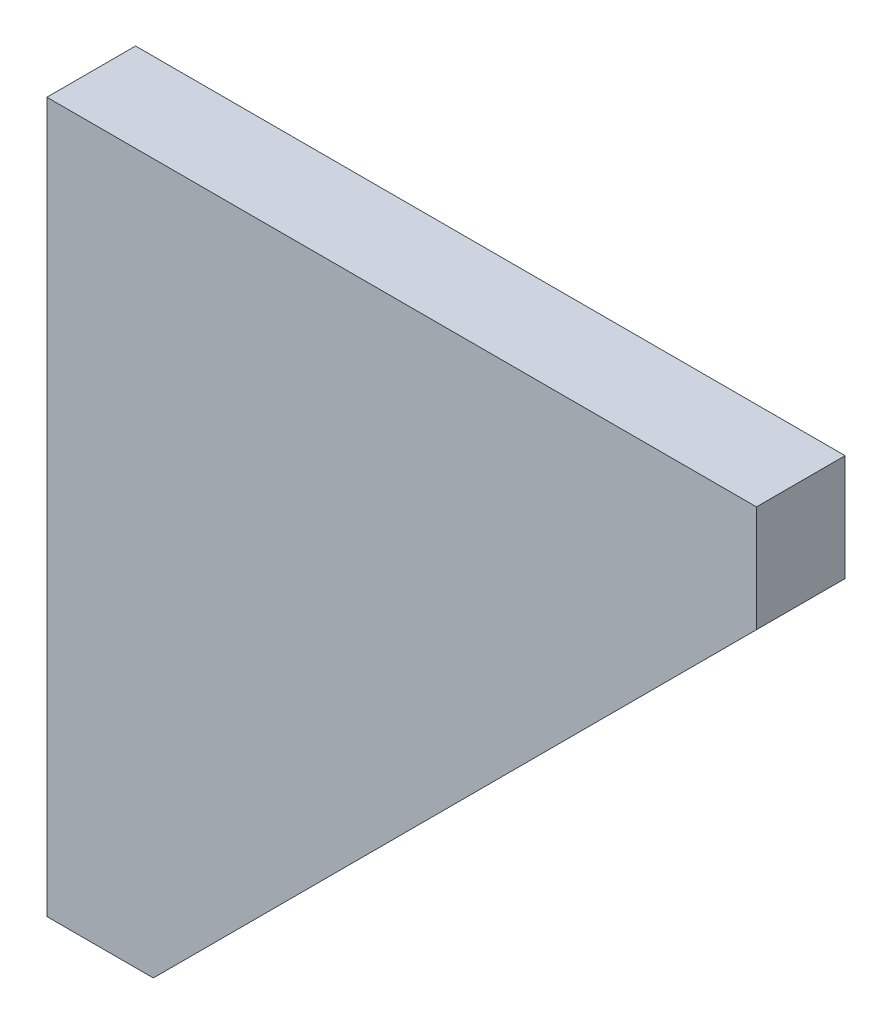
ISO-10303-21;
HEADER;
FILE_DESCRIPTION(('STEP AP214'),'2;1');
FILE_NAME('part.step','',(''),(''),'','','');
FILE_SCHEMA(('AUTOMOTIVE_DESIGN { 1 0 10303 214 1 1 1 1 }'));
ENDSEC;
DATA;
#1=APPLICATION_CONTEXT('core data for automotive mechanical design processes');
#2=APPLICATION_PROTOCOL_DEFINITION('international standard','automotive_design',2000,#1);
#3=PRODUCT_CONTEXT('',#1,'mechanical');
#4=PRODUCT('Part','Part','',(#3));
#5=PRODUCT_RELATED_PRODUCT_CATEGORY('part','',(#4));
#6=PRODUCT_DEFINITION_FORMATION('','',#4);
#7=PRODUCT_DEFINITION_CONTEXT('part definition',#1,'design');
#8=PRODUCT_DEFINITION('design','',#6,#7);
#9=PRODUCT_DEFINITION_SHAPE('','',#8);
#10=(LENGTH_UNIT() NAMED_UNIT(*) SI_UNIT(.MILLI.,.METRE.));
#11=(NAMED_UNIT(*) PLANE_ANGLE_UNIT() SI_UNIT($,.RADIAN.));
#12=(NAMED_UNIT(*) SI_UNIT($,.STERADIAN.) SOLID_ANGLE_UNIT());
#13=UNCERTAINTY_MEASURE_WITH_UNIT(LENGTH_MEASURE(1.E-05),#10,'distance_accuracy_value','');
#14=(GEOMETRIC_REPRESENTATION_CONTEXT(3) GLOBAL_UNCERTAINTY_ASSIGNED_CONTEXT((#13)) GLOBAL_UNIT_ASSIGNED_CONTEXT((#10,
#11,#12)) REPRESENTATION_CONTEXT('',''));
#15=CARTESIAN_POINT('',(0.,0.,0.));
#16=DIRECTION('',(0.,0.,1.));
#17=DIRECTION('',(1.,0.,0.));
#18=AXIS2_PLACEMENT_3D('',#15,#16,#17);
#19=CARTESIAN_POINT('',(-12.,13.,10.));
#20=DIRECTION('',(0.,-1.,0.));
#21=DIRECTION('',(0.,0.,-1.));
#22=AXIS2_PLACEMENT_3D('',#19,#20,#21);
#23=PLANE('',#22);
#24=DIRECTION('',(-1.,0.,0.));
#25=VECTOR('',#24,1.);
#26=CARTESIAN_POINT('',(-12.,13.,0.));
#27=LINE('',#26,#25);
#28=CARTESIAN_POINT('',(68.,13.,0.));
#29=VERTEX_POINT('',#28);
#30=CARTESIAN_POINT('',(-12.,13.,0.));
#31=VERTEX_POINT('',#30);
#32=EDGE_CURVE('E107',#29,#31,#27,.T.);
#33=ORIENTED_EDGE('',*,*,#32,.T.);
#34=DIRECTION('',(0.,0.,-1.));
#35=VECTOR('',#34,1.);
#36=CARTESIAN_POINT('',(-12.,13.,10.));
#37=LINE('',#36,#35);
#38=CARTESIAN_POINT('',(-12.,13.,10.));
#39=VERTEX_POINT('',#38);
#40=EDGE_CURVE('E11',#39,#31,#37,.T.);
#41=ORIENTED_EDGE('',*,*,#40,.F.);
#42=DIRECTION('',(-1.,0.,0.));
#43=VECTOR('',#42,1.);
#44=CARTESIAN_POINT('',(-12.,13.,10.));
#45=LINE('',#44,#43);
#46=CARTESIAN_POINT('',(68.,13.,10.));
#47=VERTEX_POINT('',#46);
#48=EDGE_CURVE('E115',#47,#39,#45,.T.);
#49=ORIENTED_EDGE('',*,*,#48,.F.);
#50=DIRECTION('',(0.,0.,-1.));
#51=VECTOR('',#50,1.);
#52=CARTESIAN_POINT('',(68.,13.,10.));
#53=LINE('',#52,#51);
#54=EDGE_CURVE('E103',#47,#29,#53,.T.);
#55=ORIENTED_EDGE('',*,*,#54,.T.);
#56=EDGE_LOOP('',(#33,#41,#49,#55));
#57=FACE_BOUND('',#56,.T.);
#58=ADVANCED_FACE('F33',(#57),#23,.F.);
#59=CARTESIAN_POINT('',(-12.,-67.,10.));
#60=DIRECTION('',(1.,0.,0.));
#61=DIRECTION('',(0.,0.,-1.));
#62=AXIS2_PLACEMENT_3D('',#59,#60,#61);
#63=PLANE('',#62);
#64=DIRECTION('',(0.,-1.,0.));
#65=VECTOR('',#64,1.);
#66=CARTESIAN_POINT('',(-12.,-67.,0.));
#67=LINE('',#66,#65);
#68=CARTESIAN_POINT('',(-12.,-67.,0.));
#69=VERTEX_POINT('',#68);
#70=EDGE_CURVE('E110',#31,#69,#67,.T.);
#71=ORIENTED_EDGE('',*,*,#70,.T.);
#72=DIRECTION('',(0.,0.,-1.));
#73=VECTOR('',#72,1.);
#74=CARTESIAN_POINT('',(-12.,-67.,10.));
#75=LINE('',#74,#73);
#76=CARTESIAN_POINT('',(-12.,-67.,10.));
#77=VERTEX_POINT('',#76);
#78=EDGE_CURVE('E41',#77,#69,#75,.T.);
#79=ORIENTED_EDGE('',*,*,#78,.F.);
#80=DIRECTION('',(0.,-1.,0.));
#81=VECTOR('',#80,1.);
#82=CARTESIAN_POINT('',(-12.,-67.,10.));
#83=LINE('',#82,#81);
#84=EDGE_CURVE('E83',#39,#77,#83,.T.);
#85=ORIENTED_EDGE('',*,*,#84,.F.);
#86=ORIENTED_EDGE('',*,*,#40,.T.);
#87=EDGE_LOOP('',(#71,#79,#85,#86));
#88=FACE_BOUND('',#87,.T.);
#89=ADVANCED_FACE('F134',(#88),#63,.F.);
#90=CARTESIAN_POINT('',(-12.,-67.,10.));
#91=DIRECTION('',(0.,1.,0.));
#92=DIRECTION('',(0.,0.,1.));
#93=AXIS2_PLACEMENT_3D('',#90,#91,#92);
#94=PLANE('',#93);
#95=DIRECTION('',(1.,0.,0.));
#96=VECTOR('',#95,1.);
#97=CARTESIAN_POINT('',(-12.,-67.,0.));
#98=LINE('',#97,#96);
#99=CARTESIAN_POINT('',(0.,-67.,0.));
#100=VERTEX_POINT('',#99);
#101=EDGE_CURVE('E98',#69,#100,#98,.T.);
#102=ORIENTED_EDGE('',*,*,#101,.T.);
#103=DIRECTION('',(0.,0.,-1.));
#104=VECTOR('',#103,1.);
#105=CARTESIAN_POINT('',(0.,-67.,10.));
#106=LINE('',#105,#104);
#107=CARTESIAN_POINT('',(0.,-67.,10.));
#108=VERTEX_POINT('',#107);
#109=EDGE_CURVE('E95',#108,#100,#106,.T.);
#110=ORIENTED_EDGE('',*,*,#109,.F.);
#111=DIRECTION('',(1.,0.,0.));
#112=VECTOR('',#111,1.);
#113=CARTESIAN_POINT('',(-12.,-67.,10.));
#114=LINE('',#113,#112);
#115=EDGE_CURVE('E87',#77,#108,#114,.T.);
#116=ORIENTED_EDGE('',*,*,#115,.F.);
#117=ORIENTED_EDGE('',*,*,#78,.T.);
#118=EDGE_LOOP('',(#102,#110,#116,#117));
#119=FACE_BOUND('',#118,.T.);
#120=ADVANCED_FACE('F96',(#119),#94,.F.);
#121=CARTESIAN_POINT('',(68.,1.,10.));
#122=DIRECTION('',(-0.707106781186548,0.707106781186548,0.));
#123=DIRECTION('',(-0.707106781186548,-0.707106781186548,0.));
#124=AXIS2_PLACEMENT_3D('',#121,#122,#123);
#125=PLANE('',#124);
#126=DIRECTION('',(0.707106781186547,0.707106781186547,0.));
#127=VECTOR('',#126,1.);
#128=CARTESIAN_POINT('',(68.,1.,0.));
#129=LINE('',#128,#127);
#130=CARTESIAN_POINT('',(68.,1.,0.));
#131=VERTEX_POINT('',#130);
#132=EDGE_CURVE('E69',#100,#131,#129,.T.);
#133=ORIENTED_EDGE('',*,*,#132,.T.);
#134=DIRECTION('',(0.,0.,-1.));
#135=VECTOR('',#134,1.);
#136=CARTESIAN_POINT('',(68.,1.,10.));
#137=LINE('',#136,#135);
#138=CARTESIAN_POINT('',(68.,1.,10.));
#139=VERTEX_POINT('',#138);
#140=EDGE_CURVE('E99',#139,#131,#137,.T.);
#141=ORIENTED_EDGE('',*,*,#140,.F.);
#142=DIRECTION('',(0.707106781186547,0.707106781186547,0.));
#143=VECTOR('',#142,1.);
#144=CARTESIAN_POINT('',(68.,1.,10.));
#145=LINE('',#144,#143);
#146=EDGE_CURVE('E91',#108,#139,#145,.T.);
#147=ORIENTED_EDGE('',*,*,#146,.F.);
#148=ORIENTED_EDGE('',*,*,#109,.T.);
#149=EDGE_LOOP('',(#133,#141,#147,#148));
#150=FACE_BOUND('',#149,.T.);
#151=ADVANCED_FACE('F101',(#150),#125,.F.);
#152=CARTESIAN_POINT('',(68.,13.,10.));
#153=DIRECTION('',(-1.,0.,0.));
#154=DIRECTION('',(0.,0.,1.));
#155=AXIS2_PLACEMENT_3D('',#152,#153,#154);
#156=PLANE('',#155);
#157=DIRECTION('',(0.,1.,0.));
#158=VECTOR('',#157,1.);
#159=CARTESIAN_POINT('',(68.,13.,0.));
#160=LINE('',#159,#158);
#161=EDGE_CURVE('E75',#131,#29,#160,.T.);
#162=ORIENTED_EDGE('',*,*,#161,.T.);
#163=ORIENTED_EDGE('',*,*,#54,.F.);
#164=DIRECTION('',(0.,1.,0.));
#165=VECTOR('',#164,1.);
#166=CARTESIAN_POINT('',(68.,13.,10.));
#167=LINE('',#166,#165);
#168=EDGE_CURVE('E49',#139,#47,#167,.T.);
#169=ORIENTED_EDGE('',*,*,#168,.F.);
#170=ORIENTED_EDGE('',*,*,#140,.T.);
#171=EDGE_LOOP('',(#162,#163,#169,#170));
#172=FACE_BOUND('',#171,.T.);
#173=ADVANCED_FACE('F123',(#172),#156,.F.);
#174=CARTESIAN_POINT('',(0.,0.,10.));
#175=DIRECTION('',(0.,0.,-1.));
#176=DIRECTION('',(-1.,0.,0.));
#177=AXIS2_PLACEMENT_3D('',#174,#175,#176);
#178=PLANE('',#177);
#179=ORIENTED_EDGE('',*,*,#48,.T.);
#180=ORIENTED_EDGE('',*,*,#84,.T.);
#181=ORIENTED_EDGE('',*,*,#115,.T.);
#182=ORIENTED_EDGE('',*,*,#146,.T.);
#183=ORIENTED_EDGE('',*,*,#168,.T.);
#184=EDGE_LOOP('',(#179,#180,#181,#182,#183));
#185=FACE_BOUND('',#184,.T.);
#186=ADVANCED_FACE('F89',(#185),#178,.F.);
#187=CARTESIAN_POINT('',(0.,0.,0.));
#188=DIRECTION('',(0.,0.,-1.));
#189=DIRECTION('',(-1.,0.,0.));
#190=AXIS2_PLACEMENT_3D('',#187,#188,#189);
#191=PLANE('',#190);
#192=ORIENTED_EDGE('',*,*,#32,.F.);
#193=ORIENTED_EDGE('',*,*,#161,.F.);
#194=ORIENTED_EDGE('',*,*,#132,.F.);
#195=ORIENTED_EDGE('',*,*,#101,.F.);
#196=ORIENTED_EDGE('',*,*,#70,.F.);
#197=EDGE_LOOP('',(#192,#193,#194,#195,#196));
#198=FACE_BOUND('',#197,.T.);
#199=ADVANCED_FACE('F119',(#198),#191,.T.);
#200=CLOSED_SHELL('',(#58,#89,#120,#151,#173,#186,#199));
#201=MANIFOLD_SOLID_BREP('B2',#200);
#202=ADVANCED_BREP_SHAPE_REPRESENTATION('',(#18,#201),#14);
#203=SHAPE_DEFINITION_REPRESENTATION(#9,#202);
ENDSEC;
END-ISO-10303-21;
